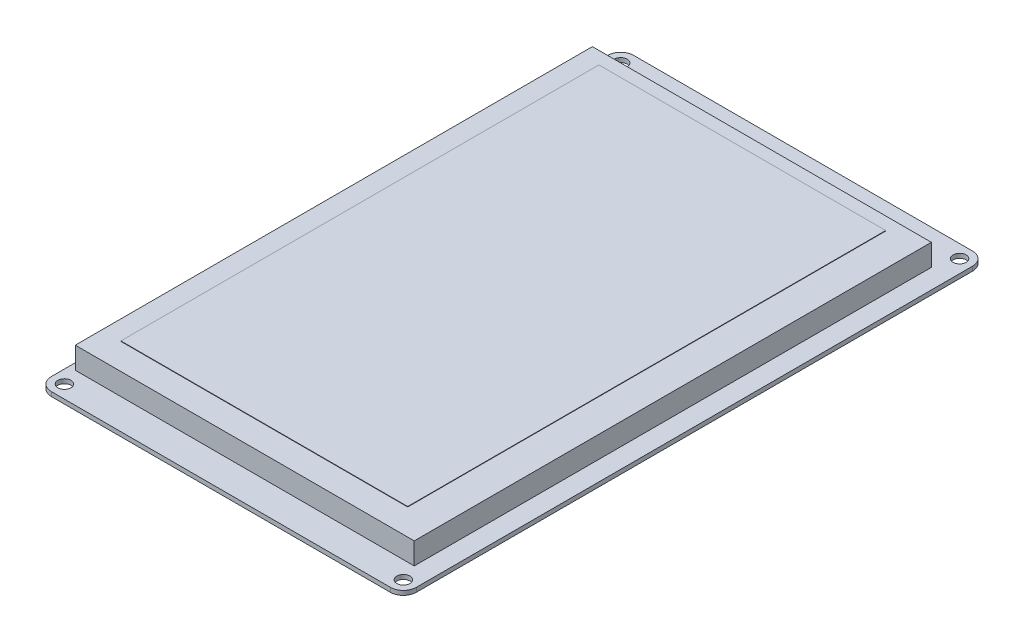
ISO-10303-21;
HEADER;
FILE_DESCRIPTION(('STEP AP214'),'2;1');
FILE_NAME('part.step','',(''),(''),'','','');
FILE_SCHEMA(('AUTOMOTIVE_DESIGN { 1 0 10303 214 1 1 1 1 }'));
ENDSEC;
DATA;
#1=APPLICATION_CONTEXT('core data for automotive mechanical design processes');
#2=APPLICATION_PROTOCOL_DEFINITION('international standard','automotive_design',2000,#1);
#3=PRODUCT_CONTEXT('',#1,'mechanical');
#4=PRODUCT('Part','Part','',(#3));
#5=PRODUCT_RELATED_PRODUCT_CATEGORY('part','',(#4));
#6=PRODUCT_DEFINITION_FORMATION('','',#4);
#7=PRODUCT_DEFINITION_CONTEXT('part definition',#1,'design');
#8=PRODUCT_DEFINITION('design','',#6,#7);
#9=PRODUCT_DEFINITION_SHAPE('','',#8);
#10=(LENGTH_UNIT() NAMED_UNIT(*) SI_UNIT(.MILLI.,.METRE.));
#11=(NAMED_UNIT(*) PLANE_ANGLE_UNIT() SI_UNIT($,.RADIAN.));
#12=(NAMED_UNIT(*) SI_UNIT($,.STERADIAN.) SOLID_ANGLE_UNIT());
#13=UNCERTAINTY_MEASURE_WITH_UNIT(LENGTH_MEASURE(1.E-05),#10,'distance_accuracy_value','');
#14=(GEOMETRIC_REPRESENTATION_CONTEXT(3) GLOBAL_UNCERTAINTY_ASSIGNED_CONTEXT((#13)) GLOBAL_UNIT_ASSIGNED_CONTEXT((#10,
#11,#12)) REPRESENTATION_CONTEXT('',''));
#15=CARTESIAN_POINT('',(0.,0.,0.));
#16=DIRECTION('',(0.,0.,1.));
#17=DIRECTION('',(1.,0.,0.));
#18=AXIS2_PLACEMENT_3D('',#15,#16,#17);
#19=CARTESIAN_POINT('',(37.5,6.,0.));
#20=DIRECTION('',(1.,0.,0.));
#21=DIRECTION('',(0.,0.,-1.));
#22=AXIS2_PLACEMENT_3D('',#19,#20,#21);
#23=PLANE('',#22);
#24=DIRECTION('',(0.,0.,-1.));
#25=VECTOR('',#24,1.);
#26=CARTESIAN_POINT('',(37.5,1.,-48.8630136986301));
#27=LINE('',#26,#25);
#28=CARTESIAN_POINT('',(37.5,1.,70.1369863013699));
#29=VERTEX_POINT('',#28);
#30=CARTESIAN_POINT('',(37.5,1.,-48.8630136986301));
#31=VERTEX_POINT('',#30);
#32=EDGE_CURVE('E177',#29,#31,#27,.T.);
#33=ORIENTED_EDGE('',*,*,#32,.T.);
#34=DIRECTION('',(0.,-1.,0.));
#35=VECTOR('',#34,1.);
#36=CARTESIAN_POINT('',(37.5,6.,-48.8630136986301));
#37=LINE('',#36,#35);
#38=CARTESIAN_POINT('',(37.5,6.,-48.8630136986301));
#39=VERTEX_POINT('',#38);
#40=EDGE_CURVE('E11',#39,#31,#37,.T.);
#41=ORIENTED_EDGE('',*,*,#40,.F.);
#42=DIRECTION('',(0.,0.,1.));
#43=VECTOR('',#42,1.);
#44=CARTESIAN_POINT('',(37.5,6.,0.));
#45=LINE('',#44,#43);
#46=CARTESIAN_POINT('',(37.5,6.,70.1369863013699));
#47=VERTEX_POINT('',#46);
#48=EDGE_CURVE('E265',#39,#47,#45,.T.);
#49=ORIENTED_EDGE('',*,*,#48,.T.);
#50=DIRECTION('',(0.,-1.,0.));
#51=VECTOR('',#50,1.);
#52=CARTESIAN_POINT('',(37.5,6.,70.1369863013699));
#53=LINE('',#52,#51);
#54=EDGE_CURVE('E275',#47,#29,#53,.T.);
#55=ORIENTED_EDGE('',*,*,#54,.T.);
#56=EDGE_LOOP('',(#33,#41,#49,#55));
#57=FACE_BOUND('',#56,.T.);
#58=ADVANCED_FACE('F34',(#57),#23,.T.);
#59=CARTESIAN_POINT('',(0.,6.,-48.8630136986301));
#60=DIRECTION('',(0.,0.,-1.));
#61=DIRECTION('',(-1.,0.,0.));
#62=AXIS2_PLACEMENT_3D('',#59,#60,#61);
#63=PLANE('',#62);
#64=DIRECTION('',(-1.,0.,0.));
#65=VECTOR('',#64,1.);
#66=CARTESIAN_POINT('',(-40.5,1.,-48.8630136986301));
#67=LINE('',#66,#65);
#68=CARTESIAN_POINT('',(-40.5,1.,-48.8630136986301));
#69=VERTEX_POINT('',#68);
#70=EDGE_CURVE('E180',#31,#69,#67,.T.);
#71=ORIENTED_EDGE('',*,*,#70,.T.);
#72=DIRECTION('',(0.,-1.,0.));
#73=VECTOR('',#72,1.);
#74=CARTESIAN_POINT('',(-40.5,6.,-48.8630136986301));
#75=LINE('',#74,#73);
#76=CARTESIAN_POINT('',(-40.5,6.,-48.8630136986301));
#77=VERTEX_POINT('',#76);
#78=EDGE_CURVE('E41',#77,#69,#75,.T.);
#79=ORIENTED_EDGE('',*,*,#78,.F.);
#80=DIRECTION('',(1.,0.,0.));
#81=VECTOR('',#80,1.);
#82=CARTESIAN_POINT('',(0.,6.,-48.8630136986301));
#83=LINE('',#82,#81);
#84=EDGE_CURVE('E268',#77,#39,#83,.T.);
#85=ORIENTED_EDGE('',*,*,#84,.T.);
#86=ORIENTED_EDGE('',*,*,#40,.T.);
#87=EDGE_LOOP('',(#71,#79,#85,#86));
#88=FACE_BOUND('',#87,.T.);
#89=ADVANCED_FACE('F287',(#88),#63,.T.);
#90=CARTESIAN_POINT('',(-40.5,6.,0.));
#91=DIRECTION('',(1.,0.,0.));
#92=DIRECTION('',(0.,0.,-1.));
#93=AXIS2_PLACEMENT_3D('',#90,#91,#92);
#94=PLANE('',#93);
#95=ORIENTED_EDGE('',*,*,#78,.T.);
#96=DIRECTION('',(0.,0.,1.));
#97=VECTOR('',#96,1.);
#98=CARTESIAN_POINT('',(-40.5,1.,-48.8630136986301));
#99=LINE('',#98,#97);
#100=CARTESIAN_POINT('',(-40.5,1.,70.1369863013699));
#101=VERTEX_POINT('',#100);
#102=EDGE_CURVE('E166',#69,#101,#99,.T.);
#103=ORIENTED_EDGE('',*,*,#102,.T.);
#104=DIRECTION('',(0.,-1.,0.));
#105=VECTOR('',#104,1.);
#106=CARTESIAN_POINT('',(-40.5,6.,70.1369863013699));
#107=LINE('',#106,#105);
#108=CARTESIAN_POINT('',(-40.5,6.,70.1369863013699));
#109=VERTEX_POINT('',#108);
#110=EDGE_CURVE('E278',#109,#101,#107,.T.);
#111=ORIENTED_EDGE('',*,*,#110,.F.);
#112=DIRECTION('',(0.,0.,1.));
#113=VECTOR('',#112,1.);
#114=CARTESIAN_POINT('',(-40.5,6.,0.));
#115=LINE('',#114,#113);
#116=EDGE_CURVE('E271',#77,#109,#115,.T.);
#117=ORIENTED_EDGE('',*,*,#116,.F.);
#118=EDGE_LOOP('',(#95,#103,#111,#117));
#119=FACE_BOUND('',#118,.T.);
#120=ADVANCED_FACE('F283',(#119),#94,.F.);
#121=CARTESIAN_POINT('',(0.,6.,70.1369863013699));
#122=DIRECTION('',(0.,0.,-1.));
#123=DIRECTION('',(-1.,0.,0.));
#124=AXIS2_PLACEMENT_3D('',#121,#122,#123);
#125=PLANE('',#124);
#126=ORIENTED_EDGE('',*,*,#110,.T.);
#127=DIRECTION('',(1.,0.,0.));
#128=VECTOR('',#127,1.);
#129=CARTESIAN_POINT('',(-40.5,1.,70.1369863013699));
#130=LINE('',#129,#128);
#131=EDGE_CURVE('E169',#101,#29,#130,.T.);
#132=ORIENTED_EDGE('',*,*,#131,.T.);
#133=ORIENTED_EDGE('',*,*,#54,.F.);
#134=DIRECTION('',(1.,0.,0.));
#135=VECTOR('',#134,1.);
#136=CARTESIAN_POINT('',(0.,6.,70.1369863013699));
#137=LINE('',#136,#135);
#138=EDGE_CURVE('E273',#109,#47,#137,.T.);
#139=ORIENTED_EDGE('',*,*,#138,.F.);
#140=EDGE_LOOP('',(#126,#132,#133,#139));
#141=FACE_BOUND('',#140,.T.);
#142=ADVANCED_FACE('F295',(#141),#125,.F.);
#143=CARTESIAN_POINT('',(0.,6.,0.));
#144=DIRECTION('',(0.,1.,0.));
#145=DIRECTION('',(0.,0.,1.));
#146=AXIS2_PLACEMENT_3D('',#143,#144,#145);
#147=PLANE('',#146);
#148=DIRECTION('',(0.,0.,1.));
#149=VECTOR('',#148,1.);
#150=CARTESIAN_POINT('',(-36.,6.,-45.8630136986301));
#151=LINE('',#150,#149);
#152=CARTESIAN_POINT('',(-36.,6.,-45.8630136986301));
#153=VERTEX_POINT('',#152);
#154=CARTESIAN_POINT('',(-36.,6.,64.1369863013699));
#155=VERTEX_POINT('',#154);
#156=EDGE_CURVE('E48',#153,#155,#151,.T.);
#157=ORIENTED_EDGE('',*,*,#156,.F.);
#158=DIRECTION('',(-1.,0.,0.));
#159=VECTOR('',#158,1.);
#160=CARTESIAN_POINT('',(-36.,6.,-45.8630136986301));
#161=LINE('',#160,#159);
#162=CARTESIAN_POINT('',(30.,6.,-45.8630136986301));
#163=VERTEX_POINT('',#162);
#164=EDGE_CURVE('E52',#163,#153,#161,.T.);
#165=ORIENTED_EDGE('',*,*,#164,.F.);
#166=DIRECTION('',(0.,0.,-1.));
#167=VECTOR('',#166,1.);
#168=CARTESIAN_POINT('',(30.,6.,-45.8630136986301));
#169=LINE('',#168,#167);
#170=CARTESIAN_POINT('',(30.,6.,64.1369863013699));
#171=VERTEX_POINT('',#170);
#172=EDGE_CURVE('E521',#171,#163,#169,.T.);
#173=ORIENTED_EDGE('',*,*,#172,.F.);
#174=DIRECTION('',(1.,0.,0.));
#175=VECTOR('',#174,1.);
#176=CARTESIAN_POINT('',(-36.,6.,64.1369863013699));
#177=LINE('',#176,#175);
#178=EDGE_CURVE('E527',#155,#171,#177,.T.);
#179=ORIENTED_EDGE('',*,*,#178,.F.);
#180=EDGE_LOOP('',(#157,#165,#173,#179));
#181=FACE_BOUND('',#180,.T.);
#182=ORIENTED_EDGE('',*,*,#48,.F.);
#183=ORIENTED_EDGE('',*,*,#84,.F.);
#184=ORIENTED_EDGE('',*,*,#116,.T.);
#185=ORIENTED_EDGE('',*,*,#138,.T.);
#186=EDGE_LOOP('',(#182,#183,#184,#185));
#187=FACE_BOUND('',#186,.T.);
#188=ADVANCED_FACE('F297',(#181,#187),#147,.T.);
#189=CARTESIAN_POINT('',(39.,1.,74.1369863013699));
#190=DIRECTION('',(0.,1.,0.));
#191=DIRECTION('',(0.,0.,1.));
#192=AXIS2_PLACEMENT_3D('',#189,#190,#191);
#193=PLANE('',#192);
#194=CARTESIAN_POINT('',(-39.,1.,74.1369863013699));
#195=DIRECTION('',(0.,1.,0.));
#196=DIRECTION('',(0.,0.,1.));
#197=AXIS2_PLACEMENT_3D('',#194,#195,#196);
#198=CIRCLE('',#197,1.5);
#199=CARTESIAN_POINT('',(-39.,1.,75.6369863013699));
#200=VERTEX_POINT('',#199);
#201=EDGE_CURVE('E190',#200,#200,#198,.T.);
#202=ORIENTED_EDGE('',*,*,#201,.F.);
#203=EDGE_LOOP('',(#202));
#204=FACE_BOUND('',#203,.T.);
#205=CARTESIAN_POINT('',(-39.,1.,-53.8630136986301));
#206=DIRECTION('',(0.,1.,0.));
#207=DIRECTION('',(0.,0.,1.));
#208=AXIS2_PLACEMENT_3D('',#205,#206,#207);
#209=CIRCLE('',#208,1.5);
#210=CARTESIAN_POINT('',(-39.,1.,-52.3630136986301));
#211=VERTEX_POINT('',#210);
#212=EDGE_CURVE('E202',#211,#211,#209,.T.);
#213=ORIENTED_EDGE('',*,*,#212,.F.);
#214=EDGE_LOOP('',(#213));
#215=FACE_BOUND('',#214,.T.);
#216=CARTESIAN_POINT('',(39.,1.,74.1369863013699));
#217=DIRECTION('',(0.,1.,0.));
#218=DIRECTION('',(0.,0.,1.));
#219=AXIS2_PLACEMENT_3D('',#216,#217,#218);
#220=CIRCLE('',#219,3.);
#221=CARTESIAN_POINT('',(39.,1.,77.1369863013699));
#222=VERTEX_POINT('',#221);
#223=CARTESIAN_POINT('',(42.,1.,74.1369863013699));
#224=VERTEX_POINT('',#223);
#225=EDGE_CURVE('E208',#222,#224,#220,.T.);
#226=ORIENTED_EDGE('',*,*,#225,.T.);
#227=DIRECTION('',(0.,0.,-1.));
#228=VECTOR('',#227,1.);
#229=CARTESIAN_POINT('',(42.,1.,-53.8630136986301));
#230=LINE('',#229,#228);
#231=CARTESIAN_POINT('',(42.,1.,-53.8630136986301));
#232=VERTEX_POINT('',#231);
#233=EDGE_CURVE('E211',#224,#232,#230,.T.);
#234=ORIENTED_EDGE('',*,*,#233,.T.);
#235=CARTESIAN_POINT('',(39.,1.,-53.8630136986301));
#236=DIRECTION('',(0.,1.,0.));
#237=DIRECTION('',(0.,0.,-1.));
#238=AXIS2_PLACEMENT_3D('',#235,#236,#237);
#239=CIRCLE('',#238,3.);
#240=CARTESIAN_POINT('',(39.,1.,-56.8630136986301));
#241=VERTEX_POINT('',#240);
#242=EDGE_CURVE('E214',#232,#241,#239,.T.);
#243=ORIENTED_EDGE('',*,*,#242,.T.);
#244=DIRECTION('',(-1.,0.,0.));
#245=VECTOR('',#244,1.);
#246=CARTESIAN_POINT('',(-39.,1.,-56.8630136986301));
#247=LINE('',#246,#245);
#248=CARTESIAN_POINT('',(-39.,1.,-56.8630136986301));
#249=VERTEX_POINT('',#248);
#250=EDGE_CURVE('E216',#241,#249,#247,.T.);
#251=ORIENTED_EDGE('',*,*,#250,.T.);
#252=CARTESIAN_POINT('',(-39.,1.,-53.8630136986301));
#253=DIRECTION('',(0.,1.,0.));
#254=DIRECTION('',(0.,0.,1.));
#255=AXIS2_PLACEMENT_3D('',#252,#253,#254);
#256=CIRCLE('',#255,3.);
#257=CARTESIAN_POINT('',(-42.,1.,-53.8630136986301));
#258=VERTEX_POINT('',#257);
#259=EDGE_CURVE('E218',#249,#258,#256,.T.);
#260=ORIENTED_EDGE('',*,*,#259,.T.);
#261=DIRECTION('',(0.,0.,1.));
#262=VECTOR('',#261,1.);
#263=CARTESIAN_POINT('',(-42.,1.,-53.8630136986301));
#264=LINE('',#263,#262);
#265=CARTESIAN_POINT('',(-42.,1.,74.1369863013699));
#266=VERTEX_POINT('',#265);
#267=EDGE_CURVE('E220',#258,#266,#264,.T.);
#268=ORIENTED_EDGE('',*,*,#267,.T.);
#269=CARTESIAN_POINT('',(-39.,1.,74.1369863013699));
#270=DIRECTION('',(0.,1.,0.));
#271=DIRECTION('',(0.,0.,1.));
#272=AXIS2_PLACEMENT_3D('',#269,#270,#271);
#273=CIRCLE('',#272,3.);
#274=CARTESIAN_POINT('',(-39.,1.,77.1369863013699));
#275=VERTEX_POINT('',#274);
#276=EDGE_CURVE('E222',#266,#275,#273,.T.);
#277=ORIENTED_EDGE('',*,*,#276,.T.);
#278=DIRECTION('',(1.,0.,0.));
#279=VECTOR('',#278,1.);
#280=CARTESIAN_POINT('',(-39.,1.,77.1369863013699));
#281=LINE('',#280,#279);
#282=EDGE_CURVE('E224',#275,#222,#281,.T.);
#283=ORIENTED_EDGE('',*,*,#282,.T.);
#284=EDGE_LOOP('',(#226,#234,#243,#251,#260,#268,#277,#283));
#285=FACE_BOUND('',#284,.T.);
#286=CARTESIAN_POINT('',(39.,1.,-53.8630136986301));
#287=DIRECTION('',(0.,1.,0.));
#288=DIRECTION('',(0.,0.,1.));
#289=AXIS2_PLACEMENT_3D('',#286,#287,#288);
#290=CIRCLE('',#289,1.5);
#291=CARTESIAN_POINT('',(39.,1.,-52.3630136986301));
#292=VERTEX_POINT('',#291);
#293=EDGE_CURVE('E196',#292,#292,#290,.T.);
#294=ORIENTED_EDGE('',*,*,#293,.F.);
#295=EDGE_LOOP('',(#294));
#296=FACE_BOUND('',#295,.T.);
#297=CARTESIAN_POINT('',(39.,1.,74.1369863013699));
#298=DIRECTION('',(0.,1.,0.));
#299=DIRECTION('',(0.,0.,1.));
#300=AXIS2_PLACEMENT_3D('',#297,#298,#299);
#301=CIRCLE('',#300,1.5);
#302=CARTESIAN_POINT('',(39.,1.,75.6369863013699));
#303=VERTEX_POINT('',#302);
#304=EDGE_CURVE('E184',#303,#303,#301,.T.);
#305=ORIENTED_EDGE('',*,*,#304,.F.);
#306=EDGE_LOOP('',(#305));
#307=FACE_BOUND('',#306,.T.);
#308=ORIENTED_EDGE('',*,*,#131,.F.);
#309=ORIENTED_EDGE('',*,*,#102,.F.);
#310=ORIENTED_EDGE('',*,*,#70,.F.);
#311=ORIENTED_EDGE('',*,*,#32,.F.);
#312=EDGE_LOOP('',(#308,#309,#310,#311));
#313=FACE_BOUND('',#312,.T.);
#314=ADVANCED_FACE('F289',(#204,#215,#285,#296,#307,#313),#193,.T.);
#315=CARTESIAN_POINT('',(39.,1.,74.1369863013699));
#316=DIRECTION('',(0.,-1.,0.));
#317=DIRECTION('',(0.,0.,-1.));
#318=AXIS2_PLACEMENT_3D('',#315,#316,#317);
#319=CYLINDRICAL_SURFACE('',#318,3.);
#320=CARTESIAN_POINT('',(39.,0.,74.1369863013699));
#321=DIRECTION('',(0.,1.,0.));
#322=DIRECTION('',(0.,0.,1.));
#323=AXIS2_PLACEMENT_3D('',#320,#321,#322);
#324=CIRCLE('',#323,3.);
#325=CARTESIAN_POINT('',(39.,0.,77.1369863013699));
#326=VERTEX_POINT('',#325);
#327=CARTESIAN_POINT('',(42.,0.,74.1369863013699));
#328=VERTEX_POINT('',#327);
#329=EDGE_CURVE('E205',#326,#328,#324,.T.);
#330=ORIENTED_EDGE('',*,*,#329,.T.);
#331=DIRECTION('',(0.,-1.,0.));
#332=VECTOR('',#331,1.);
#333=CARTESIAN_POINT('',(42.,1.,74.1369863013699));
#334=LINE('',#333,#332);
#335=EDGE_CURVE('E262',#224,#328,#334,.T.);
#336=ORIENTED_EDGE('',*,*,#335,.F.);
#337=ORIENTED_EDGE('',*,*,#225,.F.);
#338=DIRECTION('',(0.,-1.,0.));
#339=VECTOR('',#338,1.);
#340=CARTESIAN_POINT('',(39.,1.,77.1369863013699));
#341=LINE('',#340,#339);
#342=EDGE_CURVE('E226',#222,#326,#341,.T.);
#343=ORIENTED_EDGE('',*,*,#342,.T.);
#344=EDGE_LOOP('',(#330,#336,#337,#343));
#345=FACE_BOUND('',#344,.T.);
#346=ADVANCED_FACE('F304',(#345),#319,.T.);
#347=CARTESIAN_POINT('',(42.,1.,-53.8630136986301));
#348=DIRECTION('',(-1.,0.,0.));
#349=DIRECTION('',(0.,0.,1.));
#350=AXIS2_PLACEMENT_3D('',#347,#348,#349);
#351=PLANE('',#350);
#352=DIRECTION('',(0.,0.,-1.));
#353=VECTOR('',#352,1.);
#354=CARTESIAN_POINT('',(42.,0.,-53.8630136986301));
#355=LINE('',#354,#353);
#356=CARTESIAN_POINT('',(42.,0.,-53.8630136986301));
#357=VERTEX_POINT('',#356);
#358=EDGE_CURVE('E229',#328,#357,#355,.T.);
#359=ORIENTED_EDGE('',*,*,#358,.T.);
#360=DIRECTION('',(0.,-1.,0.));
#361=VECTOR('',#360,1.);
#362=CARTESIAN_POINT('',(42.,1.,-53.8630136986301));
#363=LINE('',#362,#361);
#364=EDGE_CURVE('E259',#232,#357,#363,.T.);
#365=ORIENTED_EDGE('',*,*,#364,.F.);
#366=ORIENTED_EDGE('',*,*,#233,.F.);
#367=ORIENTED_EDGE('',*,*,#335,.T.);
#368=EDGE_LOOP('',(#359,#365,#366,#367));
#369=FACE_BOUND('',#368,.T.);
#370=ADVANCED_FACE('F374',(#369),#351,.F.);
#371=CARTESIAN_POINT('',(39.,1.,-53.8630136986301));
#372=DIRECTION('',(0.,-1.,0.));
#373=DIRECTION('',(0.,0.,-1.));
#374=AXIS2_PLACEMENT_3D('',#371,#372,#373);
#375=CYLINDRICAL_SURFACE('',#374,3.);
#376=CARTESIAN_POINT('',(39.,0.,-53.8630136986301));
#377=DIRECTION('',(0.,1.,0.));
#378=DIRECTION('',(0.,0.,-1.));
#379=AXIS2_PLACEMENT_3D('',#376,#377,#378);
#380=CIRCLE('',#379,3.);
#381=CARTESIAN_POINT('',(39.,0.,-56.8630136986301));
#382=VERTEX_POINT('',#381);
#383=EDGE_CURVE('E231',#357,#382,#380,.T.);
#384=ORIENTED_EDGE('',*,*,#383,.T.);
#385=DIRECTION('',(0.,-1.,0.));
#386=VECTOR('',#385,1.);
#387=CARTESIAN_POINT('',(39.,1.,-56.8630136986301));
#388=LINE('',#387,#386);
#389=EDGE_CURVE('E256',#241,#382,#388,.T.);
#390=ORIENTED_EDGE('',*,*,#389,.F.);
#391=ORIENTED_EDGE('',*,*,#242,.F.);
#392=ORIENTED_EDGE('',*,*,#364,.T.);
#393=EDGE_LOOP('',(#384,#390,#391,#392));
#394=FACE_BOUND('',#393,.T.);
#395=ADVANCED_FACE('F370',(#394),#375,.T.);
#396=CARTESIAN_POINT('',(-39.,1.,-56.8630136986301));
#397=DIRECTION('',(0.,0.,1.));
#398=DIRECTION('',(1.,0.,0.));
#399=AXIS2_PLACEMENT_3D('',#396,#397,#398);
#400=PLANE('',#399);
#401=DIRECTION('',(-1.,0.,0.));
#402=VECTOR('',#401,1.);
#403=CARTESIAN_POINT('',(-39.,0.,-56.8630136986301));
#404=LINE('',#403,#402);
#405=CARTESIAN_POINT('',(-39.,0.,-56.8630136986301));
#406=VERTEX_POINT('',#405);
#407=EDGE_CURVE('E233',#382,#406,#404,.T.);
#408=ORIENTED_EDGE('',*,*,#407,.T.);
#409=DIRECTION('',(0.,-1.,0.));
#410=VECTOR('',#409,1.);
#411=CARTESIAN_POINT('',(-39.,1.,-56.8630136986301));
#412=LINE('',#411,#410);
#413=EDGE_CURVE('E253',#249,#406,#412,.T.);
#414=ORIENTED_EDGE('',*,*,#413,.F.);
#415=ORIENTED_EDGE('',*,*,#250,.F.);
#416=ORIENTED_EDGE('',*,*,#389,.T.);
#417=EDGE_LOOP('',(#408,#414,#415,#416));
#418=FACE_BOUND('',#417,.T.);
#419=ADVANCED_FACE('F367',(#418),#400,.F.);
#420=CARTESIAN_POINT('',(-39.,1.,-53.8630136986301));
#421=DIRECTION('',(0.,-1.,0.));
#422=DIRECTION('',(0.,0.,-1.));
#423=AXIS2_PLACEMENT_3D('',#420,#421,#422);
#424=CYLINDRICAL_SURFACE('',#423,3.);
#425=CARTESIAN_POINT('',(-39.,0.,-53.8630136986301));
#426=DIRECTION('',(0.,1.,0.));
#427=DIRECTION('',(0.,0.,1.));
#428=AXIS2_PLACEMENT_3D('',#425,#426,#427);
#429=CIRCLE('',#428,3.);
#430=CARTESIAN_POINT('',(-42.,0.,-53.8630136986301));
#431=VERTEX_POINT('',#430);
#432=EDGE_CURVE('E235',#406,#431,#429,.T.);
#433=ORIENTED_EDGE('',*,*,#432,.T.);
#434=DIRECTION('',(0.,-1.,0.));
#435=VECTOR('',#434,1.);
#436=CARTESIAN_POINT('',(-42.,1.,-53.8630136986301));
#437=LINE('',#436,#435);
#438=EDGE_CURVE('E250',#258,#431,#437,.T.);
#439=ORIENTED_EDGE('',*,*,#438,.F.);
#440=ORIENTED_EDGE('',*,*,#259,.F.);
#441=ORIENTED_EDGE('',*,*,#413,.T.);
#442=EDGE_LOOP('',(#433,#439,#440,#441));
#443=FACE_BOUND('',#442,.T.);
#444=ADVANCED_FACE('F363',(#443),#424,.T.);
#445=CARTESIAN_POINT('',(-42.,1.,-53.8630136986301));
#446=DIRECTION('',(1.,0.,0.));
#447=DIRECTION('',(0.,0.,-1.));
#448=AXIS2_PLACEMENT_3D('',#445,#446,#447);
#449=PLANE('',#448);
#450=DIRECTION('',(0.,0.,1.));
#451=VECTOR('',#450,1.);
#452=CARTESIAN_POINT('',(-42.,0.,-53.8630136986301));
#453=LINE('',#452,#451);
#454=CARTESIAN_POINT('',(-42.,0.,74.1369863013699));
#455=VERTEX_POINT('',#454);
#456=EDGE_CURVE('E237',#431,#455,#453,.T.);
#457=ORIENTED_EDGE('',*,*,#456,.T.);
#458=DIRECTION('',(0.,-1.,0.));
#459=VECTOR('',#458,1.);
#460=CARTESIAN_POINT('',(-42.,1.,74.1369863013699));
#461=LINE('',#460,#459);
#462=EDGE_CURVE('E247',#266,#455,#461,.T.);
#463=ORIENTED_EDGE('',*,*,#462,.F.);
#464=ORIENTED_EDGE('',*,*,#267,.F.);
#465=ORIENTED_EDGE('',*,*,#438,.T.);
#466=EDGE_LOOP('',(#457,#463,#464,#465));
#467=FACE_BOUND('',#466,.T.);
#468=ADVANCED_FACE('F358',(#467),#449,.F.);
#469=CARTESIAN_POINT('',(-39.,1.,74.1369863013699));
#470=DIRECTION('',(0.,-1.,0.));
#471=DIRECTION('',(0.,0.,-1.));
#472=AXIS2_PLACEMENT_3D('',#469,#470,#471);
#473=CYLINDRICAL_SURFACE('',#472,3.);
#474=CARTESIAN_POINT('',(-39.,0.,74.1369863013699));
#475=DIRECTION('',(0.,1.,0.));
#476=DIRECTION('',(0.,0.,1.));
#477=AXIS2_PLACEMENT_3D('',#474,#475,#476);
#478=CIRCLE('',#477,3.);
#479=CARTESIAN_POINT('',(-39.,0.,77.1369863013699));
#480=VERTEX_POINT('',#479);
#481=EDGE_CURVE('E239',#455,#480,#478,.T.);
#482=ORIENTED_EDGE('',*,*,#481,.T.);
#483=DIRECTION('',(0.,-1.,0.));
#484=VECTOR('',#483,1.);
#485=CARTESIAN_POINT('',(-39.,1.,77.1369863013699));
#486=LINE('',#485,#484);
#487=EDGE_CURVE('E244',#275,#480,#486,.T.);
#488=ORIENTED_EDGE('',*,*,#487,.F.);
#489=ORIENTED_EDGE('',*,*,#276,.F.);
#490=ORIENTED_EDGE('',*,*,#462,.T.);
#491=EDGE_LOOP('',(#482,#488,#489,#490));
#492=FACE_BOUND('',#491,.T.);
#493=ADVANCED_FACE('F352',(#492),#473,.T.);
#494=CARTESIAN_POINT('',(-39.,1.,77.1369863013699));
#495=DIRECTION('',(0.,0.,-1.));
#496=DIRECTION('',(-1.,0.,0.));
#497=AXIS2_PLACEMENT_3D('',#494,#495,#496);
#498=PLANE('',#497);
#499=DIRECTION('',(1.,0.,0.));
#500=VECTOR('',#499,1.);
#501=CARTESIAN_POINT('',(-39.,0.,77.1369863013699));
#502=LINE('',#501,#500);
#503=EDGE_CURVE('E212',#480,#326,#502,.T.);
#504=ORIENTED_EDGE('',*,*,#503,.T.);
#505=ORIENTED_EDGE('',*,*,#342,.F.);
#506=ORIENTED_EDGE('',*,*,#282,.F.);
#507=ORIENTED_EDGE('',*,*,#487,.T.);
#508=EDGE_LOOP('',(#504,#505,#506,#507));
#509=FACE_BOUND('',#508,.T.);
#510=ADVANCED_FACE('F348',(#509),#498,.F.);
#511=CARTESIAN_POINT('',(-39.,1.,-53.8630136986301));
#512=DIRECTION('',(0.,-1.,0.));
#513=DIRECTION('',(0.,0.,-1.));
#514=AXIS2_PLACEMENT_3D('',#511,#512,#513);
#515=CYLINDRICAL_SURFACE('',#514,1.5);
#516=ORIENTED_EDGE('',*,*,#212,.T.);
#517=EDGE_LOOP('',(#516));
#518=FACE_BOUND('',#517,.T.);
#519=CARTESIAN_POINT('',(-39.,0.,-53.8630136986301));
#520=DIRECTION('',(0.,1.,0.));
#521=DIRECTION('',(0.,0.,1.));
#522=AXIS2_PLACEMENT_3D('',#519,#520,#521);
#523=CIRCLE('',#522,1.5);
#524=CARTESIAN_POINT('',(-39.,0.,-52.3630136986301));
#525=VERTEX_POINT('',#524);
#526=EDGE_CURVE('E199',#525,#525,#523,.T.);
#527=ORIENTED_EDGE('',*,*,#526,.F.);
#528=EDGE_LOOP('',(#527));
#529=FACE_BOUND('',#528,.T.);
#530=ADVANCED_FACE('F385',(#518,#529),#515,.F.);
#531=CARTESIAN_POINT('',(39.,1.,-53.8630136986301));
#532=DIRECTION('',(0.,-1.,0.));
#533=DIRECTION('',(0.,0.,-1.));
#534=AXIS2_PLACEMENT_3D('',#531,#532,#533);
#535=CYLINDRICAL_SURFACE('',#534,1.5);
#536=ORIENTED_EDGE('',*,*,#293,.T.);
#537=EDGE_LOOP('',(#536));
#538=FACE_BOUND('',#537,.T.);
#539=CARTESIAN_POINT('',(39.,0.,-53.8630136986301));
#540=DIRECTION('',(0.,1.,0.));
#541=DIRECTION('',(0.,0.,1.));
#542=AXIS2_PLACEMENT_3D('',#539,#540,#541);
#543=CIRCLE('',#542,1.5);
#544=CARTESIAN_POINT('',(39.,0.,-52.3630136986301));
#545=VERTEX_POINT('',#544);
#546=EDGE_CURVE('E193',#545,#545,#543,.T.);
#547=ORIENTED_EDGE('',*,*,#546,.F.);
#548=EDGE_LOOP('',(#547));
#549=FACE_BOUND('',#548,.T.);
#550=ADVANCED_FACE('F382',(#538,#549),#535,.F.);
#551=CARTESIAN_POINT('',(-39.,1.,74.1369863013699));
#552=DIRECTION('',(0.,-1.,0.));
#553=DIRECTION('',(0.,0.,-1.));
#554=AXIS2_PLACEMENT_3D('',#551,#552,#553);
#555=CYLINDRICAL_SURFACE('',#554,1.5);
#556=ORIENTED_EDGE('',*,*,#201,.T.);
#557=EDGE_LOOP('',(#556));
#558=FACE_BOUND('',#557,.T.);
#559=CARTESIAN_POINT('',(-39.,0.,74.1369863013699));
#560=DIRECTION('',(0.,1.,0.));
#561=DIRECTION('',(0.,0.,1.));
#562=AXIS2_PLACEMENT_3D('',#559,#560,#561);
#563=CIRCLE('',#562,1.5);
#564=CARTESIAN_POINT('',(-39.,0.,75.6369863013699));
#565=VERTEX_POINT('',#564);
#566=EDGE_CURVE('E187',#565,#565,#563,.T.);
#567=ORIENTED_EDGE('',*,*,#566,.F.);
#568=EDGE_LOOP('',(#567));
#569=FACE_BOUND('',#568,.T.);
#570=ADVANCED_FACE('F327',(#558,#569),#555,.F.);
#571=CARTESIAN_POINT('',(39.,1.,74.1369863013699));
#572=DIRECTION('',(0.,-1.,0.));
#573=DIRECTION('',(0.,0.,-1.));
#574=AXIS2_PLACEMENT_3D('',#571,#572,#573);
#575=CYLINDRICAL_SURFACE('',#574,1.5);
#576=ORIENTED_EDGE('',*,*,#304,.T.);
#577=EDGE_LOOP('',(#576));
#578=FACE_BOUND('',#577,.T.);
#579=CARTESIAN_POINT('',(39.,0.,74.1369863013699));
#580=DIRECTION('',(0.,1.,0.));
#581=DIRECTION('',(0.,0.,1.));
#582=AXIS2_PLACEMENT_3D('',#579,#580,#581);
#583=CIRCLE('',#582,1.5);
#584=CARTESIAN_POINT('',(39.,0.,75.6369863013699));
#585=VERTEX_POINT('',#584);
#586=EDGE_CURVE('E183',#585,#585,#583,.T.);
#587=ORIENTED_EDGE('',*,*,#586,.F.);
#588=EDGE_LOOP('',(#587));
#589=FACE_BOUND('',#588,.T.);
#590=ADVANCED_FACE('F320',(#578,#589),#575,.F.);
#591=CARTESIAN_POINT('',(0.,0.,0.));
#592=DIRECTION('',(0.,1.,0.));
#593=DIRECTION('',(0.,0.,1.));
#594=AXIS2_PLACEMENT_3D('',#591,#592,#593);
#595=PLANE('',#594);
#596=ORIENTED_EDGE('',*,*,#586,.T.);
#597=EDGE_LOOP('',(#596));
#598=FACE_BOUND('',#597,.T.);
#599=ORIENTED_EDGE('',*,*,#566,.T.);
#600=EDGE_LOOP('',(#599));
#601=FACE_BOUND('',#600,.T.);
#602=ORIENTED_EDGE('',*,*,#546,.T.);
#603=EDGE_LOOP('',(#602));
#604=FACE_BOUND('',#603,.T.);
#605=ORIENTED_EDGE('',*,*,#526,.T.);
#606=EDGE_LOOP('',(#605));
#607=FACE_BOUND('',#606,.T.);
#608=ORIENTED_EDGE('',*,*,#329,.F.);
#609=ORIENTED_EDGE('',*,*,#503,.F.);
#610=ORIENTED_EDGE('',*,*,#481,.F.);
#611=ORIENTED_EDGE('',*,*,#456,.F.);
#612=ORIENTED_EDGE('',*,*,#432,.F.);
#613=ORIENTED_EDGE('',*,*,#407,.F.);
#614=ORIENTED_EDGE('',*,*,#383,.F.);
#615=ORIENTED_EDGE('',*,*,#358,.F.);
#616=EDGE_LOOP('',(#608,#609,#610,#611,#612,#613,#614,#615));
#617=FACE_BOUND('',#616,.T.);
#618=ADVANCED_FACE('F318',(#598,#601,#604,#607,#617),#595,.F.);
#619=CARTESIAN_POINT('',(-36.,6.1,-45.8630136986301));
#620=DIRECTION('',(1.,0.,0.));
#621=DIRECTION('',(0.,0.,-1.));
#622=AXIS2_PLACEMENT_3D('',#619,#620,#621);
#623=PLANE('',#622);
#624=ORIENTED_EDGE('',*,*,#156,.T.);
#625=DIRECTION('',(0.,-1.,0.));
#626=VECTOR('',#625,1.);
#627=CARTESIAN_POINT('',(-36.,6.1,64.1369863013699));
#628=LINE('',#627,#626);
#629=CARTESIAN_POINT('',(-36.,6.1,64.1369863013699));
#630=VERTEX_POINT('',#629);
#631=EDGE_CURVE('E149',#630,#155,#628,.T.);
#632=ORIENTED_EDGE('',*,*,#631,.F.);
#633=DIRECTION('',(0.,0.,1.));
#634=VECTOR('',#633,1.);
#635=CARTESIAN_POINT('',(-36.,6.1,-45.8630136986301));
#636=LINE('',#635,#634);
#637=CARTESIAN_POINT('',(-36.,6.1,-45.8630136986301));
#638=VERTEX_POINT('',#637);
#639=EDGE_CURVE('E155',#638,#630,#636,.T.);
#640=ORIENTED_EDGE('',*,*,#639,.F.);
#641=DIRECTION('',(0.,-1.,0.));
#642=VECTOR('',#641,1.);
#643=CARTESIAN_POINT('',(-36.,6.1,-45.8630136986301));
#644=LINE('',#643,#642);
#645=EDGE_CURVE('E519',#638,#153,#644,.T.);
#646=ORIENTED_EDGE('',*,*,#645,.T.);
#647=EDGE_LOOP('',(#624,#632,#640,#646));
#648=FACE_BOUND('',#647,.T.);
#649=ADVANCED_FACE('F165',(#648),#623,.F.);
#650=CARTESIAN_POINT('',(-36.,6.1,64.1369863013699));
#651=DIRECTION('',(0.,0.,-1.));
#652=DIRECTION('',(-1.,0.,0.));
#653=AXIS2_PLACEMENT_3D('',#650,#651,#652);
#654=PLANE('',#653);
#655=ORIENTED_EDGE('',*,*,#178,.T.);
#656=DIRECTION('',(0.,-1.,0.));
#657=VECTOR('',#656,1.);
#658=CARTESIAN_POINT('',(30.,6.1,64.1369863013699));
#659=LINE('',#658,#657);
#660=CARTESIAN_POINT('',(30.,6.1,64.1369863013699));
#661=VERTEX_POINT('',#660);
#662=EDGE_CURVE('E151',#661,#171,#659,.T.);
#663=ORIENTED_EDGE('',*,*,#662,.F.);
#664=DIRECTION('',(1.,0.,0.));
#665=VECTOR('',#664,1.);
#666=CARTESIAN_POINT('',(-36.,6.1,64.1369863013699));
#667=LINE('',#666,#665);
#668=EDGE_CURVE('E144',#630,#661,#667,.T.);
#669=ORIENTED_EDGE('',*,*,#668,.F.);
#670=ORIENTED_EDGE('',*,*,#631,.T.);
#671=EDGE_LOOP('',(#655,#663,#669,#670));
#672=FACE_BOUND('',#671,.T.);
#673=ADVANCED_FACE('F147',(#672),#654,.F.);
#674=CARTESIAN_POINT('',(30.,6.1,-45.8630136986301));
#675=DIRECTION('',(-1.,0.,0.));
#676=DIRECTION('',(0.,0.,1.));
#677=AXIS2_PLACEMENT_3D('',#674,#675,#676);
#678=PLANE('',#677);
#679=ORIENTED_EDGE('',*,*,#172,.T.);
#680=DIRECTION('',(0.,-1.,0.));
#681=VECTOR('',#680,1.);
#682=CARTESIAN_POINT('',(30.,6.1,-45.8630136986301));
#683=LINE('',#682,#681);
#684=CARTESIAN_POINT('',(30.,6.1,-45.8630136986301));
#685=VERTEX_POINT('',#684);
#686=EDGE_CURVE('E171',#685,#163,#683,.T.);
#687=ORIENTED_EDGE('',*,*,#686,.F.);
#688=DIRECTION('',(0.,0.,-1.));
#689=VECTOR('',#688,1.);
#690=CARTESIAN_POINT('',(30.,6.1,-45.8630136986301));
#691=LINE('',#690,#689);
#692=EDGE_CURVE('E154',#661,#685,#691,.T.);
#693=ORIENTED_EDGE('',*,*,#692,.F.);
#694=ORIENTED_EDGE('',*,*,#662,.T.);
#695=EDGE_LOOP('',(#679,#687,#693,#694));
#696=FACE_BOUND('',#695,.T.);
#697=ADVANCED_FACE('F487',(#696),#678,.F.);
#698=CARTESIAN_POINT('',(-36.,6.1,-45.8630136986301));
#699=DIRECTION('',(0.,0.,1.));
#700=DIRECTION('',(1.,0.,0.));
#701=AXIS2_PLACEMENT_3D('',#698,#699,#700);
#702=PLANE('',#701);
#703=ORIENTED_EDGE('',*,*,#164,.T.);
#704=ORIENTED_EDGE('',*,*,#645,.F.);
#705=DIRECTION('',(-1.,0.,0.));
#706=VECTOR('',#705,1.);
#707=CARTESIAN_POINT('',(-36.,6.1,-45.8630136986301));
#708=LINE('',#707,#706);
#709=EDGE_CURVE('E160',#685,#638,#708,.T.);
#710=ORIENTED_EDGE('',*,*,#709,.F.);
#711=ORIENTED_EDGE('',*,*,#686,.T.);
#712=EDGE_LOOP('',(#703,#704,#710,#711));
#713=FACE_BOUND('',#712,.T.);
#714=ADVANCED_FACE('F496',(#713),#702,.F.);
#715=CARTESIAN_POINT('',(0.,6.1,0.));
#716=DIRECTION('',(0.,1.,0.));
#717=DIRECTION('',(0.,0.,1.));
#718=AXIS2_PLACEMENT_3D('',#715,#716,#717);
#719=PLANE('',#718);
#720=ORIENTED_EDGE('',*,*,#639,.T.);
#721=ORIENTED_EDGE('',*,*,#668,.T.);
#722=ORIENTED_EDGE('',*,*,#692,.T.);
#723=ORIENTED_EDGE('',*,*,#709,.T.);
#724=EDGE_LOOP('',(#720,#721,#722,#723));
#725=FACE_BOUND('',#724,.T.);
#726=ADVANCED_FACE('F158',(#725),#719,.T.);
#727=CLOSED_SHELL('',(#58,#89,#120,#142,#188,#314,#346,#370,#395,#419,#444,#468,#493,#510,#530,
#550,#570,#590,#618,#649,#673,#697,#714,#726));
#728=MANIFOLD_SOLID_BREP('B2',#727);
#729=ADVANCED_BREP_SHAPE_REPRESENTATION('',(#18,#728),#14);
#730=SHAPE_DEFINITION_REPRESENTATION(#9,#729);
ENDSEC;
END-ISO-10303-21;
